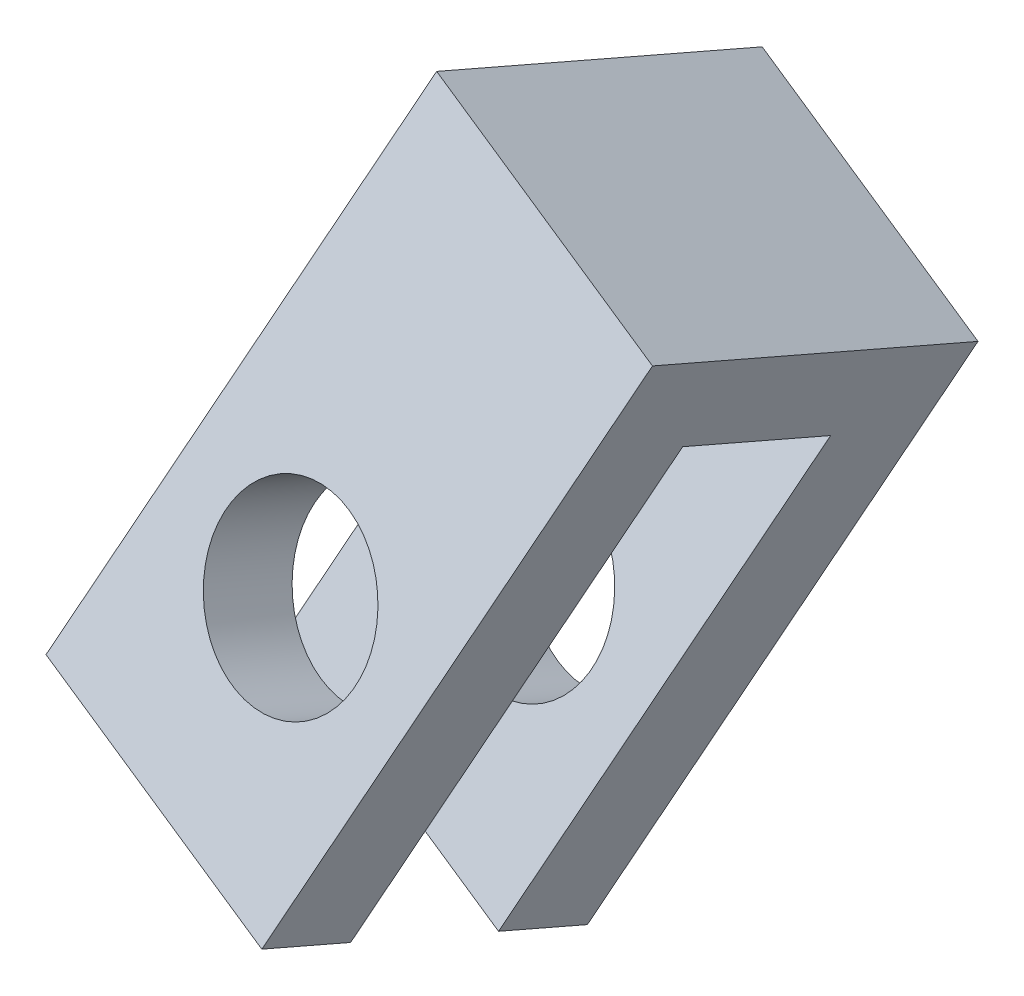
ISO-10303-21;
HEADER;
FILE_DESCRIPTION(('STEP AP214'),'2;1');
FILE_NAME('part.step','',(''),(''),'','','');
FILE_SCHEMA(('AUTOMOTIVE_DESIGN { 1 0 10303 214 1 1 1 1 }'));
ENDSEC;
DATA;
#1=APPLICATION_CONTEXT('core data for automotive mechanical design processes');
#2=APPLICATION_PROTOCOL_DEFINITION('international standard','automotive_design',2000,#1);
#3=PRODUCT_CONTEXT('',#1,'mechanical');
#4=PRODUCT('Part','Part','',(#3));
#5=PRODUCT_RELATED_PRODUCT_CATEGORY('part','',(#4));
#6=PRODUCT_DEFINITION_FORMATION('','',#4);
#7=PRODUCT_DEFINITION_CONTEXT('part definition',#1,'design');
#8=PRODUCT_DEFINITION('design','',#6,#7);
#9=PRODUCT_DEFINITION_SHAPE('','',#8);
#10=(LENGTH_UNIT() NAMED_UNIT(*) SI_UNIT(.MILLI.,.METRE.));
#11=(NAMED_UNIT(*) PLANE_ANGLE_UNIT() SI_UNIT($,.RADIAN.));
#12=(NAMED_UNIT(*) SI_UNIT($,.STERADIAN.) SOLID_ANGLE_UNIT());
#13=UNCERTAINTY_MEASURE_WITH_UNIT(LENGTH_MEASURE(1.E-05),#10,'distance_accuracy_value','');
#14=(GEOMETRIC_REPRESENTATION_CONTEXT(3) GLOBAL_UNCERTAINTY_ASSIGNED_CONTEXT((#13)) GLOBAL_UNIT_ASSIGNED_CONTEXT((#10,
#11,#12)) REPRESENTATION_CONTEXT('',''));
#15=CARTESIAN_POINT('',(0.,0.,0.));
#16=DIRECTION('',(0.,0.,1.));
#17=DIRECTION('',(1.,0.,0.));
#18=AXIS2_PLACEMENT_3D('',#15,#16,#17);
#19=CARTESIAN_POINT('',(636.080806585949,8.59855871838625,-207.638908513672));
#20=DIRECTION('',(0.354162422945148,0.881836565444647,-0.311341050968886));
#21=DIRECTION('',(-0.927957693562159,0.372685549704839,0.));
#22=AXIS2_PLACEMENT_3D('',#19,#20,#21);
#23=PLANE('',#22);
#24=DIRECTION('',(-0.0784836857791925,0.359772078695606,0.929733490016121));
#25=VECTOR('',#24,1.);
#26=CARTESIAN_POINT('',(645.399654633,5.55014399535678,-205.672633163574));
#27=LINE('',#26,#25);
#28=CARTESIAN_POINT('',(645.399654633,5.55014399535678,-205.672633163574));
#29=VERTEX_POINT('',#28);
#30=CARTESIAN_POINT('',(645.164203575662,6.62946023144359,-202.883432693526));
#31=VERTEX_POINT('',#30);
#32=EDGE_CURVE('E133',#29,#31,#27,.T.);
#33=ORIENTED_EDGE('',*,*,#32,.T.);
#34=DIRECTION('',(0.93188480470503,-0.304841472302947,0.196627535009822));
#35=VECTOR('',#34,1.);
#36=CARTESIAN_POINT('',(635.845355528612,9.67787495447306,-204.849708043624));
#37=LINE('',#36,#35);
#38=CARTESIAN_POINT('',(635.845355528612,9.67787495447306,-204.849708043624));
#39=VERTEX_POINT('',#38);
#40=EDGE_CURVE('E11',#39,#31,#37,.T.);
#41=ORIENTED_EDGE('',*,*,#40,.F.);
#42=DIRECTION('',(-0.0784836857791925,0.359772078695606,0.929733490016121));
#43=VECTOR('',#42,1.);
#44=CARTESIAN_POINT('',(636.080806585949,8.59855871838625,-207.638908513672));
#45=LINE('',#44,#43);
#46=CARTESIAN_POINT('',(636.080806585949,8.59855871838625,-207.638908513672));
#47=VERTEX_POINT('',#46);
#48=EDGE_CURVE('E148',#47,#39,#45,.T.);
#49=ORIENTED_EDGE('',*,*,#48,.F.);
#50=DIRECTION('',(0.93188480470503,-0.304841472302947,0.196627535009822));
#51=VECTOR('',#50,1.);
#52=CARTESIAN_POINT('',(636.080806585949,8.59855871838625,-207.638908513672));
#53=LINE('',#52,#51);
#54=EDGE_CURVE('E129',#47,#29,#53,.T.);
#55=ORIENTED_EDGE('',*,*,#54,.T.);
#56=EDGE_LOOP('',(#33,#41,#49,#55));
#57=FACE_BOUND('',#56,.T.);
#58=ADVANCED_FACE('F36',(#57),#23,.F.);
#59=CARTESIAN_POINT('',(635.845355528612,9.67787495447306,-204.849708043624));
#60=DIRECTION('',(0.0784836857792088,-0.359772078695604,-0.92973349001612));
#61=DIRECTION('',(0.,0.932610221230822,-0.36088526605529));
#62=AXIS2_PLACEMENT_3D('',#59,#60,#61);
#63=PLANE('',#62);
#64=CARTESIAN_POINT('',(642.983916512753,14.3265235510708,-206.045957725357));
#65=DIRECTION('',(0.0784836857792088,-0.359772078695604,-0.92973349001612));
#66=DIRECTION('',(0.,0.932610221230822,-0.36088526605529));
#67=AXIS2_PLACEMENT_3D('',#64,#65,#66);
#68=CIRCLE('',#67,3.00000000000005);
#69=CARTESIAN_POINT('',(642.983916512753,17.1243542147634,-207.128613523523));
#70=VERTEX_POINT('',#69);
#71=EDGE_CURVE('E137',#70,#70,#68,.T.);
#72=ORIENTED_EDGE('',*,*,#71,.T.);
#73=EDGE_LOOP('',(#72));
#74=FACE_BOUND('',#73,.T.);
#75=DIRECTION('',(0.354162422945148,0.88183656544465,-0.31134105096888));
#76=VECTOR('',#75,1.);
#77=CARTESIAN_POINT('',(645.164203575662,6.62946023144359,-202.883432693526));
#78=LINE('',#77,#76);
#79=CARTESIAN_POINT('',(652.247452034565,24.2661915403366,-209.110253712903));
#80=VERTEX_POINT('',#79);
#81=EDGE_CURVE('E136',#31,#80,#78,.T.);
#82=ORIENTED_EDGE('',*,*,#81,.T.);
#83=DIRECTION('',(0.93188480470503,-0.304841472302947,0.196627535009822));
#84=VECTOR('',#83,1.);
#85=CARTESIAN_POINT('',(642.928603987515,27.3146062633661,-211.076529063002));
#86=LINE('',#85,#84);
#87=CARTESIAN_POINT('',(642.928603987515,27.3146062633661,-211.076529063002));
#88=VERTEX_POINT('',#87);
#89=EDGE_CURVE('E45',#88,#80,#86,.T.);
#90=ORIENTED_EDGE('',*,*,#89,.F.);
#91=DIRECTION('',(0.354162422945148,0.88183656544465,-0.31134105096888));
#92=VECTOR('',#91,1.);
#93=CARTESIAN_POINT('',(635.845355528612,9.67787495447306,-204.849708043624));
#94=LINE('',#93,#92);
#95=EDGE_CURVE('E96',#39,#88,#94,.T.);
#96=ORIENTED_EDGE('',*,*,#95,.F.);
#97=ORIENTED_EDGE('',*,*,#40,.T.);
#98=EDGE_LOOP('',(#82,#90,#96,#97));
#99=FACE_BOUND('',#98,.T.);
#100=ADVANCED_FACE('F203',(#74,#99),#63,.F.);
#101=CARTESIAN_POINT('',(642.928603987515,27.3146062633661,-211.076529063002));
#102=DIRECTION('',(-0.354162422945148,-0.881836565444649,0.311341050968882));
#103=DIRECTION('',(0.927957693562159,-0.372685549704838,0.));
#104=AXIS2_PLACEMENT_3D('',#101,#102,#103);
#105=PLANE('',#104);
#106=DIRECTION('',(0.0784836857792091,-0.359772078695606,-0.929733490016119));
#107=VECTOR('',#106,1.);
#108=CARTESIAN_POINT('',(652.247452034565,24.2661915403366,-209.110253712903));
#109=LINE('',#108,#107);
#110=CARTESIAN_POINT('',(653.110772578136,20.3086986746849,-219.337322103081));
#111=VERTEX_POINT('',#110);
#112=EDGE_CURVE('E139',#80,#111,#109,.T.);
#113=ORIENTED_EDGE('',*,*,#112,.T.);
#114=DIRECTION('',(0.93188480470503,-0.304841472302947,0.196627535009822));
#115=VECTOR('',#114,1.);
#116=CARTESIAN_POINT('',(643.791924531086,23.3571133977144,-221.303597453179));
#117=LINE('',#116,#115);
#118=CARTESIAN_POINT('',(643.791924531086,23.3571133977144,-221.303597453179));
#119=VERTEX_POINT('',#118);
#120=EDGE_CURVE('E155',#119,#111,#117,.T.);
#121=ORIENTED_EDGE('',*,*,#120,.F.);
#122=DIRECTION('',(0.0784836857792091,-0.359772078695606,-0.929733490016119));
#123=VECTOR('',#122,1.);
#124=CARTESIAN_POINT('',(642.928603987515,27.3146062633661,-211.076529063002));
#125=LINE('',#124,#123);
#126=EDGE_CURVE('E164',#88,#119,#125,.T.);
#127=ORIENTED_EDGE('',*,*,#126,.F.);
#128=ORIENTED_EDGE('',*,*,#89,.T.);
#129=EDGE_LOOP('',(#113,#121,#127,#128));
#130=FACE_BOUND('',#129,.T.);
#131=ADVANCED_FACE('F162',(#130),#105,.F.);
#132=CARTESIAN_POINT('',(643.791924531086,23.3571133977144,-221.303597453179));
#133=DIRECTION('',(-0.0784836857792086,0.359772078695605,0.92973349001612));
#134=DIRECTION('',(0.,-0.932610221230822,0.36088526605529));
#135=AXIS2_PLACEMENT_3D('',#132,#133,#134);
#136=PLANE('',#135);
#137=CARTESIAN_POINT('',(643.847237056324,10.3690306854192,-216.273026115534));
#138=DIRECTION('',(-0.0784836857792086,0.359772078695605,0.92973349001612));
#139=DIRECTION('',(0.,-0.932610221230822,0.36088526605529));
#140=AXIS2_PLACEMENT_3D('',#137,#138,#139);
#141=CIRCLE('',#140,3.00000000000005);
#142=CARTESIAN_POINT('',(643.847237056324,7.57120002172667,-215.190370317369));
#143=VERTEX_POINT('',#142);
#144=EDGE_CURVE('E184',#143,#143,#141,.T.);
#145=ORIENTED_EDGE('',*,*,#144,.T.);
#146=EDGE_LOOP('',(#145));
#147=FACE_BOUND('',#146,.T.);
#148=DIRECTION('',(-0.354162422945148,-0.881836565444649,0.31134105096888));
#149=VECTOR('',#148,1.);
#150=CARTESIAN_POINT('',(653.110772578136,20.3086986746849,-219.337322103081));
#151=LINE('',#150,#149);
#152=CARTESIAN_POINT('',(646.027524119233,2.67196736579195,-213.110501083703));
#153=VERTEX_POINT('',#152);
#154=EDGE_CURVE('E141',#111,#153,#151,.T.);
#155=ORIENTED_EDGE('',*,*,#154,.T.);
#156=DIRECTION('',(0.93188480470503,-0.304841472302947,0.196627535009822));
#157=VECTOR('',#156,1.);
#158=CARTESIAN_POINT('',(636.708676072183,5.72038208882142,-215.076776433801));
#159=LINE('',#158,#157);
#160=CARTESIAN_POINT('',(636.708676072183,5.72038208882142,-215.076776433801));
#161=VERTEX_POINT('',#160);
#162=EDGE_CURVE('E152',#161,#153,#159,.T.);
#163=ORIENTED_EDGE('',*,*,#162,.F.);
#164=DIRECTION('',(-0.354162422945148,-0.881836565444649,0.31134105096888));
#165=VECTOR('',#164,1.);
#166=CARTESIAN_POINT('',(643.791924531086,23.3571133977144,-221.303597453179));
#167=LINE('',#166,#165);
#168=EDGE_CURVE('E176',#119,#161,#167,.T.);
#169=ORIENTED_EDGE('',*,*,#168,.F.);
#170=ORIENTED_EDGE('',*,*,#120,.T.);
#171=EDGE_LOOP('',(#155,#163,#169,#170));
#172=FACE_BOUND('',#171,.T.);
#173=ADVANCED_FACE('F172',(#147,#172),#136,.F.);
#174=CARTESIAN_POINT('',(636.708676072183,5.72038208882142,-215.076776433801));
#175=DIRECTION('',(0.354162422945147,0.881836565444652,-0.311341050968874));
#176=DIRECTION('',(-0.92795769356216,0.372685549704837,0.));
#177=AXIS2_PLACEMENT_3D('',#174,#175,#176);
#178=PLANE('',#177);
#179=DIRECTION('',(-0.0784836857792293,0.359772078695605,0.929733490016118));
#180=VECTOR('',#179,1.);
#181=CARTESIAN_POINT('',(646.027524119233,2.67196736579195,-213.110501083703));
#182=LINE('',#181,#180);
#183=CARTESIAN_POINT('',(645.792073061896,3.75128360187876,-210.321300613655));
#184=VERTEX_POINT('',#183);
#185=EDGE_CURVE('E143',#153,#184,#182,.T.);
#186=ORIENTED_EDGE('',*,*,#185,.T.);
#187=DIRECTION('',(0.93188480470503,-0.304841472302947,0.196627535009822));
#188=VECTOR('',#187,1.);
#189=CARTESIAN_POINT('',(636.473225014846,6.79969832490824,-212.287575963753));
#190=LINE('',#189,#188);
#191=CARTESIAN_POINT('',(636.473225014846,6.79969832490824,-212.287575963753));
#192=VERTEX_POINT('',#191);
#193=EDGE_CURVE('E124',#192,#184,#190,.T.);
#194=ORIENTED_EDGE('',*,*,#193,.F.);
#195=DIRECTION('',(-0.0784836857792293,0.359772078695605,0.929733490016118));
#196=VECTOR('',#195,1.);
#197=CARTESIAN_POINT('',(636.708676072183,5.72038208882142,-215.076776433801));
#198=LINE('',#197,#196);
#199=EDGE_CURVE('E115',#161,#192,#198,.T.);
#200=ORIENTED_EDGE('',*,*,#199,.F.);
#201=ORIENTED_EDGE('',*,*,#162,.T.);
#202=EDGE_LOOP('',(#186,#194,#200,#201));
#203=FACE_BOUND('',#202,.T.);
#204=ADVANCED_FACE('F175',(#203),#178,.F.);
#205=CARTESIAN_POINT('',(636.473225014846,6.79969832490824,-212.287575963753));
#206=DIRECTION('',(0.0784836857792086,-0.359772078695605,-0.92973349001612));
#207=DIRECTION('',(0.,0.932610221230822,-0.36088526605529));
#208=AXIS2_PLACEMENT_3D('',#205,#206,#207);
#209=PLANE('',#208);
#210=CARTESIAN_POINT('',(643.611785998987,11.448346921506,-213.483825645486));
#211=DIRECTION('',(0.0784836857792086,-0.359772078695605,-0.92973349001612));
#212=DIRECTION('',(0.,0.932610221230822,-0.36088526605529));
#213=AXIS2_PLACEMENT_3D('',#210,#211,#212);
#214=CIRCLE('',#213,3.00000000000005);
#215=CARTESIAN_POINT('',(643.611785998987,14.2461775851985,-214.566481443652));
#216=VERTEX_POINT('',#215);
#217=EDGE_CURVE('E187',#216,#216,#214,.T.);
#218=ORIENTED_EDGE('',*,*,#217,.T.);
#219=EDGE_LOOP('',(#218));
#220=FACE_BOUND('',#219,.T.);
#221=DIRECTION('',(0.35416242294515,0.881836565444648,-0.31134105096888));
#222=VECTOR('',#221,1.);
#223=CARTESIAN_POINT('',(645.792073061896,3.75128360187876,-210.321300613655));
#224=LINE('',#223,#222);
#225=CARTESIAN_POINT('',(651.812834251963,18.7425052144378,-215.614098480126));
#226=VERTEX_POINT('',#225);
#227=EDGE_CURVE('E123',#184,#226,#224,.T.);
#228=ORIENTED_EDGE('',*,*,#227,.T.);
#229=DIRECTION('',(0.93188480470503,-0.304841472302947,0.196627535009822));
#230=VECTOR('',#229,1.);
#231=CARTESIAN_POINT('',(642.493986204913,21.7909199374673,-217.580373830224));
#232=LINE('',#231,#230);
#233=CARTESIAN_POINT('',(642.493986204913,21.7909199374673,-217.580373830224));
#234=VERTEX_POINT('',#233);
#235=EDGE_CURVE('E120',#234,#226,#232,.T.);
#236=ORIENTED_EDGE('',*,*,#235,.F.);
#237=DIRECTION('',(0.35416242294515,0.881836565444648,-0.31134105096888));
#238=VECTOR('',#237,1.);
#239=CARTESIAN_POINT('',(636.473225014846,6.79969832490824,-212.287575963753));
#240=LINE('',#239,#238);
#241=EDGE_CURVE('E109',#192,#234,#240,.T.);
#242=ORIENTED_EDGE('',*,*,#241,.F.);
#243=ORIENTED_EDGE('',*,*,#193,.T.);
#244=EDGE_LOOP('',(#228,#236,#242,#243));
#245=FACE_BOUND('',#244,.T.);
#246=ADVANCED_FACE('F121',(#220,#245),#209,.F.);
#247=CARTESIAN_POINT('',(642.493986204913,21.7909199374673,-217.580373830224));
#248=DIRECTION('',(0.354162422945148,0.88183656544465,-0.311341050968879));
#249=DIRECTION('',(-0.92795769356216,0.372685549704838,0.));
#250=AXIS2_PLACEMENT_3D('',#247,#248,#249);
#251=PLANE('',#250);
#252=DIRECTION('',(-0.078483685779207,0.359772078695602,0.929733490016121));
#253=VECTOR('',#252,1.);
#254=CARTESIAN_POINT('',(651.812834251963,18.7425052144378,-215.614098480126));
#255=LINE('',#254,#253);
#256=CARTESIAN_POINT('',(651.420415823067,20.5413656079158,-210.965431030045));
#257=VERTEX_POINT('',#256);
#258=EDGE_CURVE('E82',#226,#257,#255,.T.);
#259=ORIENTED_EDGE('',*,*,#258,.T.);
#260=DIRECTION('',(0.93188480470503,-0.304841472302947,0.196627535009822));
#261=VECTOR('',#260,1.);
#262=CARTESIAN_POINT('',(642.101567776017,23.5897803309453,-212.931706380143));
#263=LINE('',#262,#261);
#264=CARTESIAN_POINT('',(642.101567776017,23.5897803309453,-212.931706380143));
#265=VERTEX_POINT('',#264);
#266=EDGE_CURVE('E125',#265,#257,#263,.T.);
#267=ORIENTED_EDGE('',*,*,#266,.F.);
#268=DIRECTION('',(-0.078483685779207,0.359772078695602,0.929733490016121));
#269=VECTOR('',#268,1.);
#270=CARTESIAN_POINT('',(642.493986204913,21.7909199374673,-217.580373830224));
#271=LINE('',#270,#269);
#272=EDGE_CURVE('E113',#234,#265,#271,.T.);
#273=ORIENTED_EDGE('',*,*,#272,.F.);
#274=ORIENTED_EDGE('',*,*,#235,.T.);
#275=EDGE_LOOP('',(#259,#267,#273,#274));
#276=FACE_BOUND('',#275,.T.);
#277=ADVANCED_FACE('F127',(#276),#251,.F.);
#278=CARTESIAN_POINT('',(642.101567776017,23.5897803309453,-212.931706380143));
#279=DIRECTION('',(-0.0784836857792086,0.359772078695605,0.92973349001612));
#280=DIRECTION('',(0.,-0.932610221230822,0.36088526605529));
#281=AXIS2_PLACEMENT_3D('',#278,#279,#280);
#282=PLANE('',#281);
#283=CARTESIAN_POINT('',(643.219367570091,13.247207314984,-208.835158195405));
#284=DIRECTION('',(-0.0784836857792086,0.359772078695605,0.92973349001612));
#285=DIRECTION('',(0.,-0.932610221230822,0.36088526605529));
#286=AXIS2_PLACEMENT_3D('',#283,#284,#285);
#287=CIRCLE('',#286,3.00000000000005);
#288=CARTESIAN_POINT('',(643.219367570091,10.4493766512915,-207.75250239724));
#289=VERTEX_POINT('',#288);
#290=EDGE_CURVE('E39',#289,#289,#287,.T.);
#291=ORIENTED_EDGE('',*,*,#290,.T.);
#292=EDGE_LOOP('',(#291));
#293=FACE_BOUND('',#292,.T.);
#294=DIRECTION('',(-0.35416242294515,-0.881836565444648,0.31134105096888));
#295=VECTOR('',#294,1.);
#296=CARTESIAN_POINT('',(651.420415823067,20.5413656079158,-210.965431030045));
#297=LINE('',#296,#295);
#298=EDGE_CURVE('E88',#257,#29,#297,.T.);
#299=ORIENTED_EDGE('',*,*,#298,.T.);
#300=ORIENTED_EDGE('',*,*,#54,.F.);
#301=DIRECTION('',(-0.35416242294515,-0.881836565444648,0.31134105096888));
#302=VECTOR('',#301,1.);
#303=CARTESIAN_POINT('',(642.101567776017,23.5897803309453,-212.931706380143));
#304=LINE('',#303,#302);
#305=EDGE_CURVE('E53',#265,#47,#304,.T.);
#306=ORIENTED_EDGE('',*,*,#305,.F.);
#307=ORIENTED_EDGE('',*,*,#266,.T.);
#308=EDGE_LOOP('',(#299,#300,#306,#307));
#309=FACE_BOUND('',#308,.T.);
#310=ADVANCED_FACE('F194',(#293,#309),#282,.F.);
#311=CARTESIAN_POINT('',(511.889275418187,-167.451040715236,108.008549892917));
#312=DIRECTION('',(-0.931884804705032,0.304841472302952,-0.196627535009808));
#313=DIRECTION('',(-0.310910996875678,-0.950439031196516,0.));
#314=AXIS2_PLACEMENT_3D('',#311,#312,#313);
#315=PLANE('',#314);
#316=ORIENTED_EDGE('',*,*,#48,.T.);
#317=ORIENTED_EDGE('',*,*,#95,.T.);
#318=ORIENTED_EDGE('',*,*,#126,.T.);
#319=ORIENTED_EDGE('',*,*,#168,.T.);
#320=ORIENTED_EDGE('',*,*,#199,.T.);
#321=ORIENTED_EDGE('',*,*,#241,.T.);
#322=ORIENTED_EDGE('',*,*,#272,.T.);
#323=ORIENTED_EDGE('',*,*,#305,.T.);
#324=EDGE_LOOP('',(#316,#317,#318,#319,#320,#321,#322,#323));
#325=FACE_BOUND('',#324,.T.);
#326=ADVANCED_FACE('F111',(#325),#315,.T.);
#327=CARTESIAN_POINT('',(521.208123465238,-170.499455438265,109.974825243015));
#328=DIRECTION('',(-0.931884804705032,0.304841472302952,-0.196627535009808));
#329=DIRECTION('',(-0.310910996875678,-0.950439031196516,0.));
#330=AXIS2_PLACEMENT_3D('',#327,#328,#329);
#331=PLANE('',#330);
#332=ORIENTED_EDGE('',*,*,#32,.F.);
#333=ORIENTED_EDGE('',*,*,#298,.F.);
#334=ORIENTED_EDGE('',*,*,#258,.F.);
#335=ORIENTED_EDGE('',*,*,#227,.F.);
#336=ORIENTED_EDGE('',*,*,#185,.F.);
#337=ORIENTED_EDGE('',*,*,#154,.F.);
#338=ORIENTED_EDGE('',*,*,#112,.F.);
#339=ORIENTED_EDGE('',*,*,#81,.F.);
#340=EDGE_LOOP('',(#332,#333,#334,#335,#336,#337,#338,#339));
#341=FACE_BOUND('',#340,.T.);
#342=ADVANCED_FACE('F168',(#341),#331,.F.);
#343=CARTESIAN_POINT('',(642.342444585081,17.2670542684057,-198.446952554529));
#344=DIRECTION('',(0.0784836857792086,-0.359772078695605,-0.929733490016119));
#345=DIRECTION('',(0.,0.932610221230822,-0.36088526605529));
#346=AXIS2_PLACEMENT_3D('',#343,#344,#345);
#347=CYLINDRICAL_SURFACE('',#346,3.00000000000005);
#348=ORIENTED_EDGE('',*,*,#290,.F.);
#349=EDGE_LOOP('',(#348));
#350=FACE_BOUND('',#349,.T.);
#351=ORIENTED_EDGE('',*,*,#71,.F.);
#352=EDGE_LOOP('',(#351));
#353=FACE_BOUND('',#352,.T.);
#354=ADVANCED_FACE('F196',(#350,#353),#347,.F.);
#355=ORIENTED_EDGE('',*,*,#217,.F.);
#356=EDGE_LOOP('',(#355));
#357=FACE_BOUND('',#356,.T.);
#358=ORIENTED_EDGE('',*,*,#144,.F.);
#359=EDGE_LOOP('',(#358));
#360=FACE_BOUND('',#359,.T.);
#361=ADVANCED_FACE('F199',(#357,#360),#347,.F.);
#362=CLOSED_SHELL('',(#58,#100,#131,#173,#204,#246,#277,#310,#326,#342,#354,#361));
#363=MANIFOLD_SOLID_BREP('B2',#362);
#364=ADVANCED_BREP_SHAPE_REPRESENTATION('',(#18,#363),#14);
#365=SHAPE_DEFINITION_REPRESENTATION(#9,#364);
ENDSEC;
END-ISO-10303-21;
